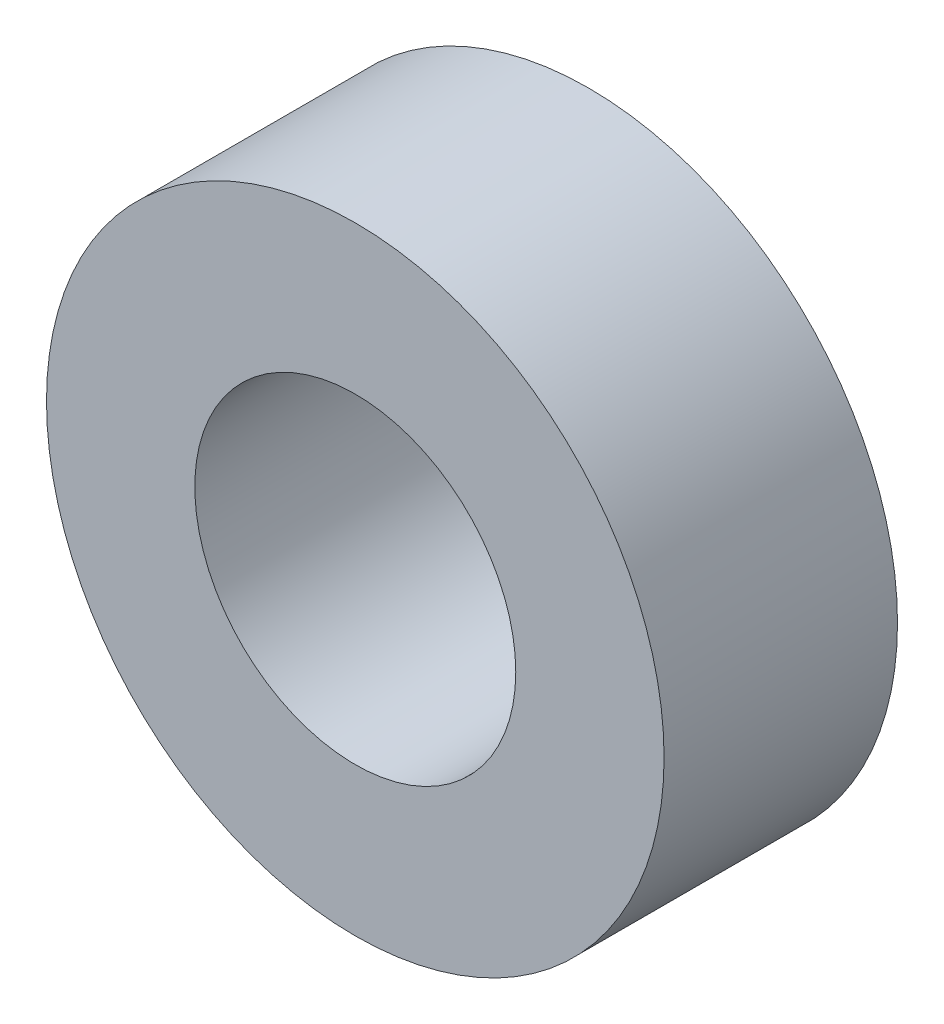
ISO-10303-21;
HEADER;
FILE_DESCRIPTION(('STEP AP214'),'2;1');
FILE_NAME('part.step','',(''),(''),'','','');
FILE_SCHEMA(('AUTOMOTIVE_DESIGN { 1 0 10303 214 1 1 1 1 }'));
ENDSEC;
DATA;
#1=APPLICATION_CONTEXT('core data for automotive mechanical design processes');
#2=APPLICATION_PROTOCOL_DEFINITION('international standard','automotive_design',2000,#1);
#3=PRODUCT_CONTEXT('',#1,'mechanical');
#4=PRODUCT('Part','Part','',(#3));
#5=PRODUCT_RELATED_PRODUCT_CATEGORY('part','',(#4));
#6=PRODUCT_DEFINITION_FORMATION('','',#4);
#7=PRODUCT_DEFINITION_CONTEXT('part definition',#1,'design');
#8=PRODUCT_DEFINITION('design','',#6,#7);
#9=PRODUCT_DEFINITION_SHAPE('','',#8);
#10=(LENGTH_UNIT() NAMED_UNIT(*) SI_UNIT(.MILLI.,.METRE.));
#11=(NAMED_UNIT(*) PLANE_ANGLE_UNIT() SI_UNIT($,.RADIAN.));
#12=(NAMED_UNIT(*) SI_UNIT($,.STERADIAN.) SOLID_ANGLE_UNIT());
#13=UNCERTAINTY_MEASURE_WITH_UNIT(LENGTH_MEASURE(1.E-05),#10,'distance_accuracy_value','');
#14=(GEOMETRIC_REPRESENTATION_CONTEXT(3) GLOBAL_UNCERTAINTY_ASSIGNED_CONTEXT((#13)) GLOBAL_UNIT_ASSIGNED_CONTEXT((#10,
#11,#12)) REPRESENTATION_CONTEXT('',''));
#15=CARTESIAN_POINT('',(0.,0.,0.));
#16=DIRECTION('',(0.,0.,1.));
#17=DIRECTION('',(1.,0.,0.));
#18=AXIS2_PLACEMENT_3D('',#15,#16,#17);
#19=CARTESIAN_POINT('',(0.,0.,2.4));
#20=DIRECTION('',(0.,0.,-1.));
#21=DIRECTION('',(-1.,0.,0.));
#22=AXIS2_PLACEMENT_3D('',#19,#20,#21);
#23=CYLINDRICAL_SURFACE('',#22,3.175);
#24=CARTESIAN_POINT('',(0.,0.,2.4));
#25=DIRECTION('',(0.,0.,1.));
#26=DIRECTION('',(1.,0.,0.));
#27=AXIS2_PLACEMENT_3D('',#24,#25,#26);
#28=CIRCLE('',#27,3.175);
#29=CARTESIAN_POINT('',(3.175,0.,2.4));
#30=VERTEX_POINT('',#29);
#31=EDGE_CURVE('E10',#30,#30,#28,.T.);
#32=ORIENTED_EDGE('',*,*,#31,.F.);
#33=EDGE_LOOP('',(#32));
#34=FACE_BOUND('',#33,.T.);
#35=CARTESIAN_POINT('',(0.,0.,0.));
#36=DIRECTION('',(0.,0.,1.));
#37=DIRECTION('',(1.,0.,0.));
#38=AXIS2_PLACEMENT_3D('',#35,#36,#37);
#39=CIRCLE('',#38,3.175);
#40=CARTESIAN_POINT('',(3.175,0.,0.));
#41=VERTEX_POINT('',#40);
#42=EDGE_CURVE('E36',#41,#41,#39,.T.);
#43=ORIENTED_EDGE('',*,*,#42,.T.);
#44=EDGE_LOOP('',(#43));
#45=FACE_BOUND('',#44,.T.);
#46=ADVANCED_FACE('F33',(#34,#45),#23,.T.);
#47=CARTESIAN_POINT('',(0.,0.,2.4));
#48=DIRECTION('',(0.,0.,1.));
#49=DIRECTION('',(1.,0.,0.));
#50=AXIS2_PLACEMENT_3D('',#47,#48,#49);
#51=PLANE('',#50);
#52=CARTESIAN_POINT('',(0.,0.,2.4));
#53=DIRECTION('',(0.,0.,1.));
#54=DIRECTION('',(1.,0.,0.));
#55=AXIS2_PLACEMENT_3D('',#52,#53,#54);
#56=CIRCLE('',#55,1.65);
#57=CARTESIAN_POINT('',(1.65,0.,2.4));
#58=VERTEX_POINT('',#57);
#59=EDGE_CURVE('E43',#58,#58,#56,.T.);
#60=ORIENTED_EDGE('',*,*,#59,.F.);
#61=EDGE_LOOP('',(#60));
#62=FACE_BOUND('',#61,.T.);
#63=ORIENTED_EDGE('',*,*,#31,.T.);
#64=EDGE_LOOP('',(#63));
#65=FACE_BOUND('',#64,.T.);
#66=ADVANCED_FACE('F54',(#62,#65),#51,.T.);
#67=CARTESIAN_POINT('',(0.,0.,0.));
#68=DIRECTION('',(0.,0.,1.));
#69=DIRECTION('',(1.,0.,0.));
#70=AXIS2_PLACEMENT_3D('',#67,#68,#69);
#71=PLANE('',#70);
#72=CARTESIAN_POINT('',(0.,0.,0.));
#73=DIRECTION('',(0.,0.,1.));
#74=DIRECTION('',(1.,0.,0.));
#75=AXIS2_PLACEMENT_3D('',#72,#73,#74);
#76=CIRCLE('',#75,1.65);
#77=CARTESIAN_POINT('',(1.65,0.,0.));
#78=VERTEX_POINT('',#77);
#79=EDGE_CURVE('E45',#78,#78,#76,.T.);
#80=ORIENTED_EDGE('',*,*,#79,.T.);
#81=EDGE_LOOP('',(#80));
#82=FACE_BOUND('',#81,.T.);
#83=ORIENTED_EDGE('',*,*,#42,.F.);
#84=EDGE_LOOP('',(#83));
#85=FACE_BOUND('',#84,.T.);
#86=ADVANCED_FACE('F56',(#82,#85),#71,.F.);
#87=CARTESIAN_POINT('',(0.,0.,2.4));
#88=DIRECTION('',(0.,0.,-1.));
#89=DIRECTION('',(-1.,0.,0.));
#90=AXIS2_PLACEMENT_3D('',#87,#88,#89);
#91=CYLINDRICAL_SURFACE('',#90,1.65);
#92=ORIENTED_EDGE('',*,*,#59,.T.);
#93=EDGE_LOOP('',(#92));
#94=FACE_BOUND('',#93,.T.);
#95=ORIENTED_EDGE('',*,*,#79,.F.);
#96=EDGE_LOOP('',(#95));
#97=FACE_BOUND('',#96,.T.);
#98=ADVANCED_FACE('F51',(#94,#97),#91,.F.);
#99=CLOSED_SHELL('',(#46,#66,#86,#98));
#100=MANIFOLD_SOLID_BREP('B2',#99);
#101=ADVANCED_BREP_SHAPE_REPRESENTATION('',(#18,#100),#14);
#102=SHAPE_DEFINITION_REPRESENTATION(#9,#101);
ENDSEC;
END-ISO-10303-21;
